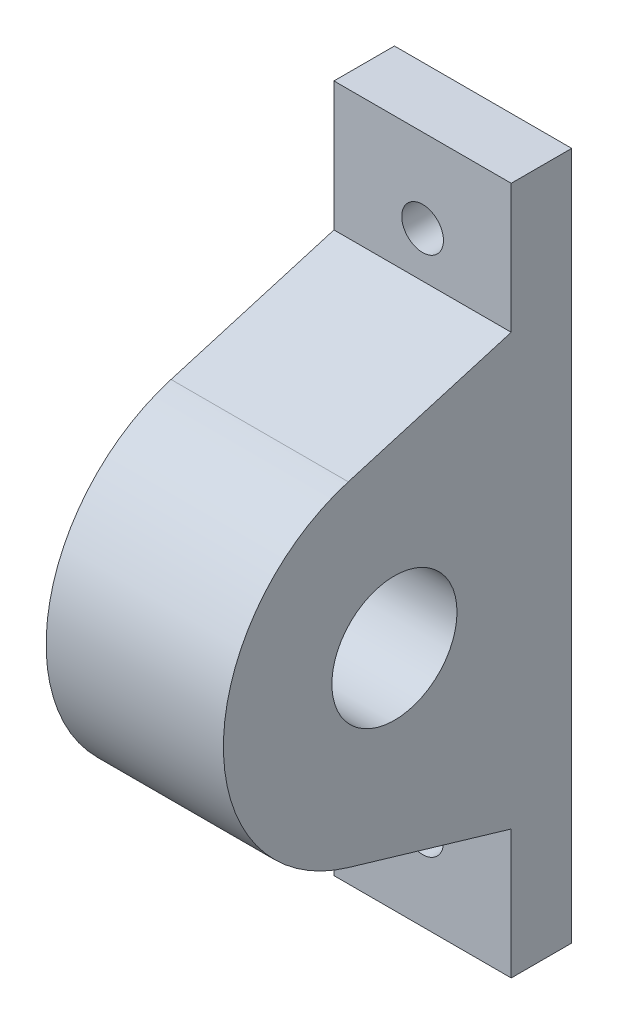
ISO-10303-21;
HEADER;
FILE_DESCRIPTION(('STEP AP214'),'2;1');
FILE_NAME('part.step','',(''),(''),'','','');
FILE_SCHEMA(('AUTOMOTIVE_DESIGN { 1 0 10303 214 1 1 1 1 }'));
ENDSEC;
DATA;
#1=APPLICATION_CONTEXT('core data for automotive mechanical design processes');
#2=APPLICATION_PROTOCOL_DEFINITION('international standard','automotive_design',2000,#1);
#3=PRODUCT_CONTEXT('',#1,'mechanical');
#4=PRODUCT('Part','Part','',(#3));
#5=PRODUCT_RELATED_PRODUCT_CATEGORY('part','',(#4));
#6=PRODUCT_DEFINITION_FORMATION('','',#4);
#7=PRODUCT_DEFINITION_CONTEXT('part definition',#1,'design');
#8=PRODUCT_DEFINITION('design','',#6,#7);
#9=PRODUCT_DEFINITION_SHAPE('','',#8);
#10=(LENGTH_UNIT() NAMED_UNIT(*) SI_UNIT(.MILLI.,.METRE.));
#11=(NAMED_UNIT(*) PLANE_ANGLE_UNIT() SI_UNIT($,.RADIAN.));
#12=(NAMED_UNIT(*) SI_UNIT($,.STERADIAN.) SOLID_ANGLE_UNIT());
#13=UNCERTAINTY_MEASURE_WITH_UNIT(LENGTH_MEASURE(1.E-05),#10,'distance_accuracy_value','');
#14=(GEOMETRIC_REPRESENTATION_CONTEXT(3) GLOBAL_UNCERTAINTY_ASSIGNED_CONTEXT((#13)) GLOBAL_UNIT_ASSIGNED_CONTEXT((#10,
#11,#12)) REPRESENTATION_CONTEXT('',''));
#15=CARTESIAN_POINT('',(0.,0.,0.));
#16=DIRECTION('',(0.,0.,1.));
#17=DIRECTION('',(1.,0.,0.));
#18=AXIS2_PLACEMENT_3D('',#15,#16,#17);
#19=CARTESIAN_POINT('',(85.,0.,0.));
#20=DIRECTION('',(1.,0.,0.));
#21=DIRECTION('',(0.,0.,-1.));
#22=AXIS2_PLACEMENT_3D('',#19,#20,#21);
#23=PLANE('',#22);
#24=DIRECTION('',(0.,0.,1.));
#25=VECTOR('',#24,1.);
#26=CARTESIAN_POINT('',(85.,165.,-83.5));
#27=LINE('',#26,#25);
#28=CARTESIAN_POINT('',(85.,165.,-83.5));
#29=VERTEX_POINT('',#28);
#30=CARTESIAN_POINT('',(85.,165.,-54.5));
#31=VERTEX_POINT('',#30);
#32=EDGE_CURVE('E172',#29,#31,#27,.T.);
#33=ORIENTED_EDGE('',*,*,#32,.T.);
#34=DIRECTION('',(0.,-1.,0.));
#35=VECTOR('',#34,1.);
#36=CARTESIAN_POINT('',(85.,165.,-54.5));
#37=LINE('',#36,#35);
#38=CARTESIAN_POINT('',(85.,103.12562301035,-54.5));
#39=VERTEX_POINT('',#38);
#40=EDGE_CURVE('E108',#31,#39,#37,.T.);
#41=ORIENTED_EDGE('',*,*,#40,.T.);
#42=DIRECTION('',(0.,-0.282839119358989,0.959167364207223));
#43=VECTOR('',#42,1.);
#44=CARTESIAN_POINT('',(85.,80.0904749113031,23.6170664664756));
#45=LINE('',#44,#43);
#46=CARTESIAN_POINT('',(85.,80.0904749113031,23.6170664664756));
#47=VERTEX_POINT('',#46);
#48=EDGE_CURVE('E218',#39,#47,#45,.T.);
#49=ORIENTED_EDGE('',*,*,#48,.T.);
#50=CARTESIAN_POINT('',(85.,0.,0.));
#51=DIRECTION('',(1.,0.,0.));
#52=DIRECTION('',(0.,0.,-1.));
#53=AXIS2_PLACEMENT_3D('',#50,#51,#52);
#54=CIRCLE('',#53,83.5);
#55=CARTESIAN_POINT('',(85.,-80.0904749113031,23.6170664664755));
#56=VERTEX_POINT('',#55);
#57=EDGE_CURVE('E221',#47,#56,#54,.T.);
#58=ORIENTED_EDGE('',*,*,#57,.T.);
#59=DIRECTION('',(0.,-0.282839119358989,-0.959167364207223));
#60=VECTOR('',#59,1.);
#61=CARTESIAN_POINT('',(85.,-80.0904749113031,23.6170664664755));
#62=LINE('',#61,#60);
#63=CARTESIAN_POINT('',(85.,-103.12562301035,-54.5));
#64=VERTEX_POINT('',#63);
#65=EDGE_CURVE('E127',#56,#64,#62,.T.);
#66=ORIENTED_EDGE('',*,*,#65,.T.);
#67=DIRECTION('',(0.,-1.,0.));
#68=VECTOR('',#67,1.);
#69=CARTESIAN_POINT('',(85.,-165.,-54.5));
#70=LINE('',#69,#68);
#71=CARTESIAN_POINT('',(85.,-165.,-54.5));
#72=VERTEX_POINT('',#71);
#73=EDGE_CURVE('E121',#64,#72,#70,.T.);
#74=ORIENTED_EDGE('',*,*,#73,.T.);
#75=DIRECTION('',(0.,0.,-1.));
#76=VECTOR('',#75,1.);
#77=CARTESIAN_POINT('',(85.,-165.,-83.4999999999999));
#78=LINE('',#77,#76);
#79=CARTESIAN_POINT('',(85.,-165.,-83.4999999999999));
#80=VERTEX_POINT('',#79);
#81=EDGE_CURVE('E125',#72,#80,#78,.T.);
#82=ORIENTED_EDGE('',*,*,#81,.T.);
#83=DIRECTION('',(0.,1.,0.));
#84=VECTOR('',#83,1.);
#85=CARTESIAN_POINT('',(85.,-165.,-83.4999999999999));
#86=LINE('',#85,#84);
#87=EDGE_CURVE('E65',#80,#29,#86,.T.);
#88=ORIENTED_EDGE('',*,*,#87,.T.);
#89=EDGE_LOOP('',(#33,#41,#49,#58,#66,#74,#82,#88));
#90=FACE_BOUND('',#89,.T.);
#91=CARTESIAN_POINT('',(85.,0.,1.5));
#92=DIRECTION('',(1.,0.,0.));
#93=DIRECTION('',(0.,0.,-1.));
#94=AXIS2_PLACEMENT_3D('',#91,#92,#93);
#95=CIRCLE('',#94,30.);
#96=CARTESIAN_POINT('',(85.,0.,-28.5));
#97=VERTEX_POINT('',#96);
#98=EDGE_CURVE('E154',#97,#97,#95,.T.);
#99=ORIENTED_EDGE('',*,*,#98,.F.);
#100=EDGE_LOOP('',(#99));
#101=FACE_BOUND('',#100,.T.);
#102=ADVANCED_FACE('F45',(#90,#101),#23,.T.);
#103=CARTESIAN_POINT('',(0.,0.,0.));
#104=DIRECTION('',(1.,0.,0.));
#105=DIRECTION('',(0.,0.,-1.));
#106=AXIS2_PLACEMENT_3D('',#103,#104,#105);
#107=PLANE('',#106);
#108=DIRECTION('',(0.,0.,1.));
#109=VECTOR('',#108,1.);
#110=CARTESIAN_POINT('',(0.,165.,-83.5));
#111=LINE('',#110,#109);
#112=CARTESIAN_POINT('',(0.,165.,-83.5));
#113=VERTEX_POINT('',#112);
#114=CARTESIAN_POINT('',(0.,165.,-54.5));
#115=VERTEX_POINT('',#114);
#116=EDGE_CURVE('E149',#113,#115,#111,.T.);
#117=ORIENTED_EDGE('',*,*,#116,.F.);
#118=DIRECTION('',(0.,1.,0.));
#119=VECTOR('',#118,1.);
#120=CARTESIAN_POINT('',(0.,-165.,-83.4999999999999));
#121=LINE('',#120,#119);
#122=CARTESIAN_POINT('',(0.,-165.,-83.4999999999999));
#123=VERTEX_POINT('',#122);
#124=EDGE_CURVE('E100',#123,#113,#121,.T.);
#125=ORIENTED_EDGE('',*,*,#124,.F.);
#126=DIRECTION('',(0.,0.,-1.));
#127=VECTOR('',#126,1.);
#128=CARTESIAN_POINT('',(0.,-165.,-83.4999999999999));
#129=LINE('',#128,#127);
#130=CARTESIAN_POINT('',(0.,-165.,-54.5));
#131=VERTEX_POINT('',#130);
#132=EDGE_CURVE('E94',#131,#123,#129,.T.);
#133=ORIENTED_EDGE('',*,*,#132,.F.);
#134=DIRECTION('',(0.,-1.,0.));
#135=VECTOR('',#134,1.);
#136=CARTESIAN_POINT('',(0.,-165.,-54.5));
#137=LINE('',#136,#135);
#138=CARTESIAN_POINT('',(0.,-103.12562301035,-54.5));
#139=VERTEX_POINT('',#138);
#140=EDGE_CURVE('E136',#139,#131,#137,.T.);
#141=ORIENTED_EDGE('',*,*,#140,.F.);
#142=DIRECTION('',(0.,-0.282839119358989,-0.959167364207223));
#143=VECTOR('',#142,1.);
#144=CARTESIAN_POINT('',(0.,-80.0904749113031,23.6170664664755));
#145=LINE('',#144,#143);
#146=CARTESIAN_POINT('',(0.,-80.0904749113031,23.6170664664755));
#147=VERTEX_POINT('',#146);
#148=EDGE_CURVE('E163',#147,#139,#145,.T.);
#149=ORIENTED_EDGE('',*,*,#148,.F.);
#150=CARTESIAN_POINT('',(0.,0.,0.));
#151=DIRECTION('',(1.,0.,0.));
#152=DIRECTION('',(0.,0.,-1.));
#153=AXIS2_PLACEMENT_3D('',#150,#151,#152);
#154=CIRCLE('',#153,83.5);
#155=CARTESIAN_POINT('',(0.,80.0904749113031,23.6170664664756));
#156=VERTEX_POINT('',#155);
#157=EDGE_CURVE('E160',#156,#147,#154,.T.);
#158=ORIENTED_EDGE('',*,*,#157,.F.);
#159=DIRECTION('',(0.,-0.282839119358989,0.959167364207223));
#160=VECTOR('',#159,1.);
#161=CARTESIAN_POINT('',(0.,80.0904749113031,23.6170664664756));
#162=LINE('',#161,#160);
#163=CARTESIAN_POINT('',(0.,103.12562301035,-54.5));
#164=VERTEX_POINT('',#163);
#165=EDGE_CURVE('E157',#164,#156,#162,.T.);
#166=ORIENTED_EDGE('',*,*,#165,.F.);
#167=DIRECTION('',(0.,-1.,0.));
#168=VECTOR('',#167,1.);
#169=CARTESIAN_POINT('',(0.,165.,-54.5));
#170=LINE('',#169,#168);
#171=EDGE_CURVE('E153',#115,#164,#170,.T.);
#172=ORIENTED_EDGE('',*,*,#171,.F.);
#173=EDGE_LOOP('',(#117,#125,#133,#141,#149,#158,#166,#172));
#174=FACE_BOUND('',#173,.T.);
#175=CARTESIAN_POINT('',(0.,0.,1.5));
#176=DIRECTION('',(1.,0.,0.));
#177=DIRECTION('',(0.,0.,-1.));
#178=AXIS2_PLACEMENT_3D('',#175,#176,#177);
#179=CIRCLE('',#178,30.);
#180=CARTESIAN_POINT('',(0.,0.,-28.5));
#181=VERTEX_POINT('',#180);
#182=EDGE_CURVE('E198',#181,#181,#179,.T.);
#183=ORIENTED_EDGE('',*,*,#182,.T.);
#184=EDGE_LOOP('',(#183));
#185=FACE_BOUND('',#184,.T.);
#186=ADVANCED_FACE('F236',(#174,#185),#107,.F.);
#187=CARTESIAN_POINT('',(85.,165.,-83.5));
#188=DIRECTION('',(0.,-1.,0.));
#189=DIRECTION('',(0.,0.,-1.));
#190=AXIS2_PLACEMENT_3D('',#187,#188,#189);
#191=PLANE('',#190);
#192=ORIENTED_EDGE('',*,*,#116,.T.);
#193=DIRECTION('',(-1.,0.,0.));
#194=VECTOR('',#193,1.);
#195=CARTESIAN_POINT('',(85.,165.,-54.5));
#196=LINE('',#195,#194);
#197=EDGE_CURVE('E11',#31,#115,#196,.T.);
#198=ORIENTED_EDGE('',*,*,#197,.F.);
#199=ORIENTED_EDGE('',*,*,#32,.F.);
#200=DIRECTION('',(-1.,0.,0.));
#201=VECTOR('',#200,1.);
#202=CARTESIAN_POINT('',(85.,165.,-83.5));
#203=LINE('',#202,#201);
#204=EDGE_CURVE('E145',#29,#113,#203,.T.);
#205=ORIENTED_EDGE('',*,*,#204,.T.);
#206=EDGE_LOOP('',(#192,#198,#199,#205));
#207=FACE_BOUND('',#206,.T.);
#208=ADVANCED_FACE('F47',(#207),#191,.F.);
#209=CARTESIAN_POINT('',(85.,165.,-54.5));
#210=DIRECTION('',(0.,0.,-1.));
#211=DIRECTION('',(0.,1.,0.));
#212=AXIS2_PLACEMENT_3D('',#209,#210,#211);
#213=PLANE('',#212);
#214=CARTESIAN_POINT('',(42.5,125.,-54.5));
#215=DIRECTION('',(0.,0.,1.));
#216=DIRECTION('',(1.,0.,0.));
#217=AXIS2_PLACEMENT_3D('',#214,#215,#216);
#218=CIRCLE('',#217,10.);
#219=CARTESIAN_POINT('',(52.5,125.,-54.5));
#220=VERTEX_POINT('',#219);
#221=EDGE_CURVE('E200',#220,#220,#218,.T.);
#222=ORIENTED_EDGE('',*,*,#221,.F.);
#223=EDGE_LOOP('',(#222));
#224=FACE_BOUND('',#223,.T.);
#225=ORIENTED_EDGE('',*,*,#171,.T.);
#226=DIRECTION('',(-1.,0.,0.));
#227=VECTOR('',#226,1.);
#228=CARTESIAN_POINT('',(85.,103.12562301035,-54.5));
#229=LINE('',#228,#227);
#230=EDGE_CURVE('E56',#39,#164,#229,.T.);
#231=ORIENTED_EDGE('',*,*,#230,.F.);
#232=ORIENTED_EDGE('',*,*,#40,.F.);
#233=ORIENTED_EDGE('',*,*,#197,.T.);
#234=EDGE_LOOP('',(#225,#231,#232,#233));
#235=FACE_BOUND('',#234,.T.);
#236=ADVANCED_FACE('F329',(#224,#235),#213,.F.);
#237=CARTESIAN_POINT('',(85.,80.0904749113031,23.6170664664756));
#238=DIRECTION('',(0.,-0.959167364207223,-0.282839119358989));
#239=DIRECTION('',(0.,0.282839119358989,-0.959167364207223));
#240=AXIS2_PLACEMENT_3D('',#237,#238,#239);
#241=PLANE('',#240);
#242=ORIENTED_EDGE('',*,*,#165,.T.);
#243=DIRECTION('',(-1.,0.,0.));
#244=VECTOR('',#243,1.);
#245=CARTESIAN_POINT('',(85.,80.0904749113031,23.6170664664756));
#246=LINE('',#245,#244);
#247=EDGE_CURVE('E183',#47,#156,#246,.T.);
#248=ORIENTED_EDGE('',*,*,#247,.F.);
#249=ORIENTED_EDGE('',*,*,#48,.F.);
#250=ORIENTED_EDGE('',*,*,#230,.T.);
#251=EDGE_LOOP('',(#242,#248,#249,#250));
#252=FACE_BOUND('',#251,.T.);
#253=ADVANCED_FACE('F320',(#252),#241,.F.);
#254=CARTESIAN_POINT('',(85.,0.,0.));
#255=DIRECTION('',(-1.,0.,0.));
#256=DIRECTION('',(0.,0.,1.));
#257=AXIS2_PLACEMENT_3D('',#254,#255,#256);
#258=CYLINDRICAL_SURFACE('',#257,83.5);
#259=ORIENTED_EDGE('',*,*,#157,.T.);
#260=DIRECTION('',(-1.,0.,0.));
#261=VECTOR('',#260,1.);
#262=CARTESIAN_POINT('',(85.,-80.0904749113031,23.6170664664755));
#263=LINE('',#262,#261);
#264=EDGE_CURVE('E179',#56,#147,#263,.T.);
#265=ORIENTED_EDGE('',*,*,#264,.F.);
#266=ORIENTED_EDGE('',*,*,#57,.F.);
#267=ORIENTED_EDGE('',*,*,#247,.T.);
#268=EDGE_LOOP('',(#259,#265,#266,#267));
#269=FACE_BOUND('',#268,.T.);
#270=ADVANCED_FACE('F229',(#269),#258,.T.);
#271=CARTESIAN_POINT('',(85.,-80.0904749113031,23.6170664664755));
#272=DIRECTION('',(0.,0.959167364207223,-0.282839119358989));
#273=DIRECTION('',(0.,0.282839119358989,0.959167364207223));
#274=AXIS2_PLACEMENT_3D('',#271,#272,#273);
#275=PLANE('',#274);
#276=ORIENTED_EDGE('',*,*,#148,.T.);
#277=DIRECTION('',(-1.,0.,0.));
#278=VECTOR('',#277,1.);
#279=CARTESIAN_POINT('',(85.,-103.12562301035,-54.5));
#280=LINE('',#279,#278);
#281=EDGE_CURVE('E138',#64,#139,#280,.T.);
#282=ORIENTED_EDGE('',*,*,#281,.F.);
#283=ORIENTED_EDGE('',*,*,#65,.F.);
#284=ORIENTED_EDGE('',*,*,#264,.T.);
#285=EDGE_LOOP('',(#276,#282,#283,#284));
#286=FACE_BOUND('',#285,.T.);
#287=ADVANCED_FACE('F233',(#286),#275,.F.);
#288=CARTESIAN_POINT('',(85.,-165.,-54.5));
#289=DIRECTION('',(0.,0.,-1.));
#290=DIRECTION('',(0.,1.,0.));
#291=AXIS2_PLACEMENT_3D('',#288,#289,#290);
#292=PLANE('',#291);
#293=CARTESIAN_POINT('',(42.5000000000001,-125.,-54.5));
#294=DIRECTION('',(0.,0.,1.));
#295=DIRECTION('',(-1.,0.,0.));
#296=AXIS2_PLACEMENT_3D('',#293,#294,#295);
#297=CIRCLE('',#296,10.);
#298=CARTESIAN_POINT('',(32.5000000000001,-125.,-54.5));
#299=VERTEX_POINT('',#298);
#300=EDGE_CURVE('E192',#299,#299,#297,.T.);
#301=ORIENTED_EDGE('',*,*,#300,.F.);
#302=EDGE_LOOP('',(#301));
#303=FACE_BOUND('',#302,.T.);
#304=ORIENTED_EDGE('',*,*,#140,.T.);
#305=DIRECTION('',(-1.,0.,0.));
#306=VECTOR('',#305,1.);
#307=CARTESIAN_POINT('',(85.,-165.,-54.5));
#308=LINE('',#307,#306);
#309=EDGE_CURVE('E133',#72,#131,#308,.T.);
#310=ORIENTED_EDGE('',*,*,#309,.F.);
#311=ORIENTED_EDGE('',*,*,#73,.F.);
#312=ORIENTED_EDGE('',*,*,#281,.T.);
#313=EDGE_LOOP('',(#304,#310,#311,#312));
#314=FACE_BOUND('',#313,.T.);
#315=ADVANCED_FACE('F134',(#303,#314),#292,.F.);
#316=CARTESIAN_POINT('',(85.,-165.,-83.4999999999999));
#317=DIRECTION('',(0.,1.,0.));
#318=DIRECTION('',(0.,0.,1.));
#319=AXIS2_PLACEMENT_3D('',#316,#317,#318);
#320=PLANE('',#319);
#321=ORIENTED_EDGE('',*,*,#132,.T.);
#322=DIRECTION('',(-1.,0.,0.));
#323=VECTOR('',#322,1.);
#324=CARTESIAN_POINT('',(85.,-165.,-83.4999999999999));
#325=LINE('',#324,#323);
#326=EDGE_CURVE('E139',#80,#123,#325,.T.);
#327=ORIENTED_EDGE('',*,*,#326,.F.);
#328=ORIENTED_EDGE('',*,*,#81,.F.);
#329=ORIENTED_EDGE('',*,*,#309,.T.);
#330=EDGE_LOOP('',(#321,#327,#328,#329));
#331=FACE_BOUND('',#330,.T.);
#332=ADVANCED_FACE('F141',(#331),#320,.F.);
#333=CARTESIAN_POINT('',(85.,-165.,-83.4999999999999));
#334=DIRECTION('',(0.,0.,1.));
#335=DIRECTION('',(0.,-1.,0.));
#336=AXIS2_PLACEMENT_3D('',#333,#334,#335);
#337=PLANE('',#336);
#338=CARTESIAN_POINT('',(42.5000000000001,-125.,-83.5));
#339=DIRECTION('',(0.,0.,1.));
#340=DIRECTION('',(0.,-1.,0.));
#341=AXIS2_PLACEMENT_3D('',#338,#339,#340);
#342=CIRCLE('',#341,10.);
#343=CARTESIAN_POINT('',(42.5000000000001,-135.,-83.5));
#344=VERTEX_POINT('',#343);
#345=EDGE_CURVE('E49',#344,#344,#342,.T.);
#346=ORIENTED_EDGE('',*,*,#345,.T.);
#347=EDGE_LOOP('',(#346));
#348=FACE_BOUND('',#347,.T.);
#349=CARTESIAN_POINT('',(42.5,125.,-83.5));
#350=DIRECTION('',(0.,0.,1.));
#351=DIRECTION('',(0.,-1.,0.));
#352=AXIS2_PLACEMENT_3D('',#349,#350,#351);
#353=CIRCLE('',#352,10.);
#354=CARTESIAN_POINT('',(42.5,115.,-83.5));
#355=VERTEX_POINT('',#354);
#356=EDGE_CURVE('E189',#355,#355,#353,.T.);
#357=ORIENTED_EDGE('',*,*,#356,.T.);
#358=EDGE_LOOP('',(#357));
#359=FACE_BOUND('',#358,.T.);
#360=ORIENTED_EDGE('',*,*,#124,.T.);
#361=ORIENTED_EDGE('',*,*,#204,.F.);
#362=ORIENTED_EDGE('',*,*,#87,.F.);
#363=ORIENTED_EDGE('',*,*,#326,.T.);
#364=EDGE_LOOP('',(#360,#361,#362,#363));
#365=FACE_BOUND('',#364,.T.);
#366=ADVANCED_FACE('F242',(#348,#359,#365),#337,.F.);
#367=CARTESIAN_POINT('',(85.,0.,1.5));
#368=DIRECTION('',(-1.,0.,0.));
#369=DIRECTION('',(0.,0.,1.));
#370=AXIS2_PLACEMENT_3D('',#367,#368,#369);
#371=CYLINDRICAL_SURFACE('',#370,30.);
#372=ORIENTED_EDGE('',*,*,#98,.T.);
#373=EDGE_LOOP('',(#372));
#374=FACE_BOUND('',#373,.T.);
#375=ORIENTED_EDGE('',*,*,#182,.F.);
#376=EDGE_LOOP('',(#375));
#377=FACE_BOUND('',#376,.T.);
#378=ADVANCED_FACE('F244',(#374,#377),#371,.F.);
#379=CARTESIAN_POINT('',(42.5,125.,-139.5));
#380=DIRECTION('',(0.,0.,1.));
#381=DIRECTION('',(1.,0.,0.));
#382=AXIS2_PLACEMENT_3D('',#379,#380,#381);
#383=CYLINDRICAL_SURFACE('',#382,10.);
#384=ORIENTED_EDGE('',*,*,#221,.T.);
#385=EDGE_LOOP('',(#384));
#386=FACE_BOUND('',#385,.T.);
#387=ORIENTED_EDGE('',*,*,#356,.F.);
#388=EDGE_LOOP('',(#387));
#389=FACE_BOUND('',#388,.T.);
#390=ADVANCED_FACE('F252',(#386,#389),#383,.F.);
#391=CARTESIAN_POINT('',(42.5000000000001,-125.,-139.5));
#392=DIRECTION('',(0.,0.,1.));
#393=DIRECTION('',(1.,0.,0.));
#394=AXIS2_PLACEMENT_3D('',#391,#392,#393);
#395=CYLINDRICAL_SURFACE('',#394,10.);
#396=ORIENTED_EDGE('',*,*,#300,.T.);
#397=EDGE_LOOP('',(#396));
#398=FACE_BOUND('',#397,.T.);
#399=ORIENTED_EDGE('',*,*,#345,.F.);
#400=EDGE_LOOP('',(#399));
#401=FACE_BOUND('',#400,.T.);
#402=ADVANCED_FACE('F265',(#398,#401),#395,.F.);
#403=CLOSED_SHELL('',(#102,#186,#208,#236,#253,#270,#287,#315,#332,#366,#378,#390,#402));
#404=MANIFOLD_SOLID_BREP('B2',#403);
#405=ADVANCED_BREP_SHAPE_REPRESENTATION('',(#18,#404),#14);
#406=SHAPE_DEFINITION_REPRESENTATION(#9,#405);
ENDSEC;
END-ISO-10303-21;
